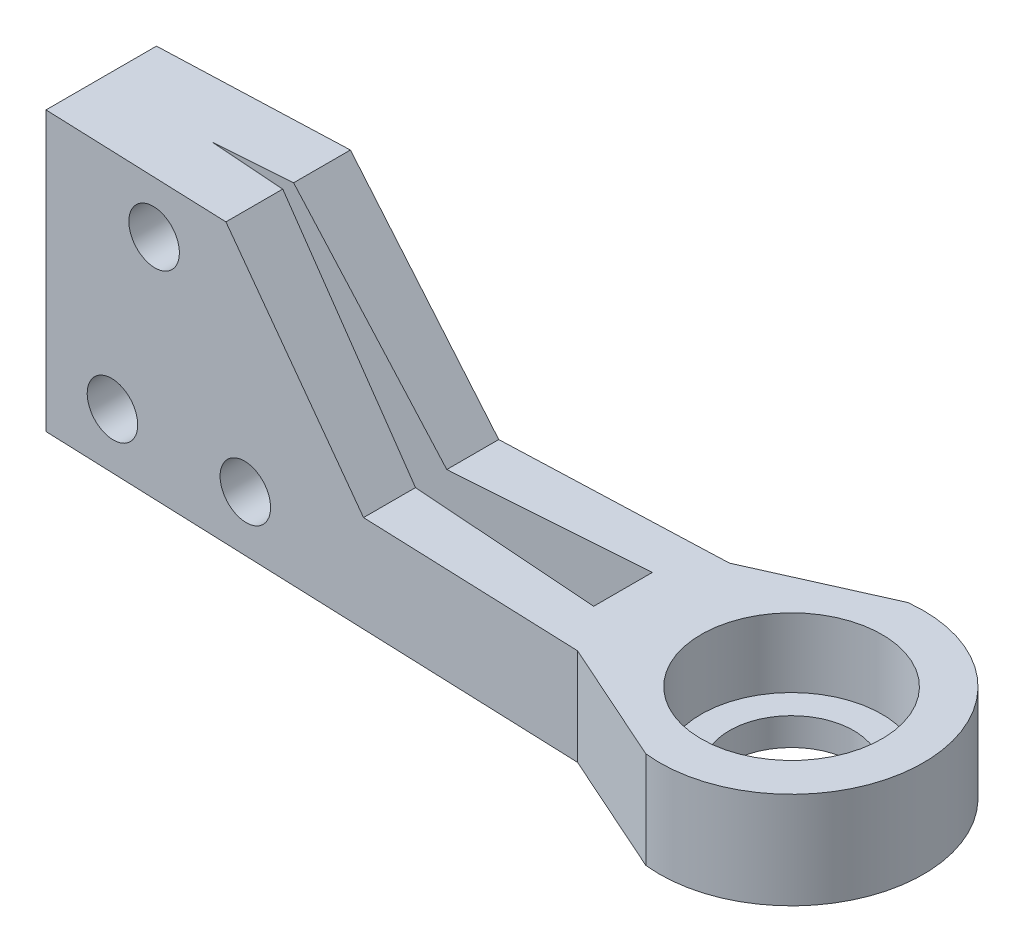
ISO-10303-21;
HEADER;
FILE_DESCRIPTION(('STEP AP214'),'2;1');
FILE_NAME('part.step','',(''),(''),'','','');
FILE_SCHEMA(('AUTOMOTIVE_DESIGN { 1 0 10303 214 1 1 1 1 }'));
ENDSEC;
DATA;
#1=APPLICATION_CONTEXT('core data for automotive mechanical design processes');
#2=APPLICATION_PROTOCOL_DEFINITION('international standard','automotive_design',2000,#1);
#3=PRODUCT_CONTEXT('',#1,'mechanical');
#4=PRODUCT('Part','Part','',(#3));
#5=PRODUCT_RELATED_PRODUCT_CATEGORY('part','',(#4));
#6=PRODUCT_DEFINITION_FORMATION('','',#4);
#7=PRODUCT_DEFINITION_CONTEXT('part definition',#1,'design');
#8=PRODUCT_DEFINITION('design','',#6,#7);
#9=PRODUCT_DEFINITION_SHAPE('','',#8);
#10=(LENGTH_UNIT() NAMED_UNIT(*) SI_UNIT(.MILLI.,.METRE.));
#11=(NAMED_UNIT(*) PLANE_ANGLE_UNIT() SI_UNIT($,.RADIAN.));
#12=(NAMED_UNIT(*) SI_UNIT($,.STERADIAN.) SOLID_ANGLE_UNIT());
#13=UNCERTAINTY_MEASURE_WITH_UNIT(LENGTH_MEASURE(1.E-05),#10,'distance_accuracy_value','');
#14=(GEOMETRIC_REPRESENTATION_CONTEXT(3) GLOBAL_UNCERTAINTY_ASSIGNED_CONTEXT((#13)) GLOBAL_UNIT_ASSIGNED_CONTEXT((#10,
#11,#12)) REPRESENTATION_CONTEXT('',''));
#15=CARTESIAN_POINT('',(0.,0.,0.));
#16=DIRECTION('',(0.,0.,1.));
#17=DIRECTION('',(1.,0.,0.));
#18=AXIS2_PLACEMENT_3D('',#15,#16,#17);
#19=CARTESIAN_POINT('',(0.,7.,0.));
#20=DIRECTION('',(0.,1.,0.));
#21=DIRECTION('',(0.,0.,1.));
#22=AXIS2_PLACEMENT_3D('',#19,#20,#21);
#23=PLANE('',#22);
#24=CARTESIAN_POINT('',(50.,7.,0.));
#25=DIRECTION('',(0.,1.,0.));
#26=DIRECTION('',(0.,0.,1.));
#27=AXIS2_PLACEMENT_3D('',#24,#25,#26);
#28=CIRCLE('',#27,6.55);
#29=CARTESIAN_POINT('',(50.,7.,6.55));
#30=VERTEX_POINT('',#29);
#31=EDGE_CURVE('E218',#30,#30,#28,.T.);
#32=ORIENTED_EDGE('',*,*,#31,.F.);
#33=EDGE_LOOP('',(#32));
#34=FACE_BOUND('',#33,.T.);
#35=DIRECTION('',(0.,0.,-1.));
#36=VECTOR('',#35,1.);
#37=CARTESIAN_POINT('',(23.8949359429024,7.,31.7454653822312));
#38=LINE('',#37,#36);
#39=CARTESIAN_POINT('',(23.8949359429024,7.,-1.13401235386877));
#40=VERTEX_POINT('',#39);
#41=CARTESIAN_POINT('',(23.8949359429024,7.,-4.89606009785884));
#42=VERTEX_POINT('',#41);
#43=EDGE_CURVE('E195',#40,#42,#38,.T.);
#44=ORIENTED_EDGE('',*,*,#43,.F.);
#45=DIRECTION('',(0.997458699830735,0.,-0.0712470499879073));
#46=VECTOR('',#45,1.);
#47=CARTESIAN_POINT('',(0.040704380653495,7.,0.56986132914895));
#48=LINE('',#47,#46);
#49=CARTESIAN_POINT('',(37.7929497533245,7.,-2.12672762604175));
#50=VERTEX_POINT('',#49);
#51=EDGE_CURVE('E175',#40,#50,#48,.T.);
#52=ORIENTED_EDGE('',*,*,#51,.T.);
#53=DIRECTION('',(0.,0.,1.));
#54=VECTOR('',#53,1.);
#55=CARTESIAN_POINT('',(37.7929497533245,7.,0.));
#56=LINE('',#55,#54);
#57=CARTESIAN_POINT('',(37.7929497533245,7.,2.12672762604175));
#58=VERTEX_POINT('',#57);
#59=EDGE_CURVE('E139',#50,#58,#56,.T.);
#60=ORIENTED_EDGE('',*,*,#59,.T.);
#61=DIRECTION('',(-0.997458699830735,0.,-0.0712470499879073));
#62=VECTOR('',#61,1.);
#63=CARTESIAN_POINT('',(0.040704380653495,7.,-0.569861329148949));
#64=LINE('',#63,#62);
#65=CARTESIAN_POINT('',(23.8949359429024,7.,1.13401235386878));
#66=VERTEX_POINT('',#65);
#67=EDGE_CURVE('E167',#58,#66,#64,.T.);
#68=ORIENTED_EDGE('',*,*,#67,.T.);
#69=CARTESIAN_POINT('',(23.8949359429024,7.,4.89606009785884));
#70=VERTEX_POINT('',#69);
#71=EDGE_CURVE('E191',#70,#66,#38,.T.);
#72=ORIENTED_EDGE('',*,*,#71,.F.);
#73=DIRECTION('',(0.999297615709181,0.,0.0374736605890943));
#74=VECTOR('',#73,1.);
#75=CARTESIAN_POINT('',(-0.149789358714308,7.,3.99438289904821));
#76=LINE('',#75,#74);
#77=CARTESIAN_POINT('',(40.,7.,5.5));
#78=VERTEX_POINT('',#77);
#79=EDGE_CURVE('E236',#70,#78,#76,.T.);
#80=ORIENTED_EDGE('',*,*,#79,.T.);
#81=DIRECTION('',(0.913079703293892,0.,0.407781136680865));
#82=VECTOR('',#81,1.);
#83=CARTESIAN_POINT('',(4.60356648121777,7.,-10.3080371764565));
#84=LINE('',#83,#82);
#85=CARTESIAN_POINT('',(48.9351861273453,7.,9.49045159181595));
#86=VERTEX_POINT('',#85);
#87=EDGE_CURVE('E225',#78,#86,#84,.T.);
#88=ORIENTED_EDGE('',*,*,#87,.T.);
#89=CARTESIAN_POINT('',(50.,7.,0.));
#90=DIRECTION('',(0.,1.,0.));
#91=DIRECTION('',(0.,0.,1.));
#92=AXIS2_PLACEMENT_3D('',#89,#90,#91);
#93=CIRCLE('',#92,9.55);
#94=CARTESIAN_POINT('',(48.9351861273453,7.,-9.49045159181595));
#95=VERTEX_POINT('',#94);
#96=EDGE_CURVE('E228',#86,#95,#93,.T.);
#97=ORIENTED_EDGE('',*,*,#96,.T.);
#98=DIRECTION('',(0.913079703293892,0.,-0.407781136680865));
#99=VECTOR('',#98,1.);
#100=CARTESIAN_POINT('',(4.60356648121777,7.,10.3080371764565));
#101=LINE('',#100,#99);
#102=CARTESIAN_POINT('',(40.,7.,-5.5));
#103=VERTEX_POINT('',#102);
#104=EDGE_CURVE('E231',#103,#95,#101,.T.);
#105=ORIENTED_EDGE('',*,*,#104,.F.);
#106=DIRECTION('',(0.999297615709181,0.,-0.0374736605890943));
#107=VECTOR('',#106,1.);
#108=CARTESIAN_POINT('',(-0.149789358714308,7.,-3.99438289904821));
#109=LINE('',#108,#107);
#110=EDGE_CURVE('E234',#42,#103,#109,.T.);
#111=ORIENTED_EDGE('',*,*,#110,.F.);
#112=EDGE_LOOP('',(#44,#52,#60,#68,#72,#80,#88,#97,#105,#111));
#113=FACE_BOUND('',#112,.T.);
#114=ADVANCED_FACE('F35',(#34,#113),#23,.T.);
#115=CARTESIAN_POINT('',(0.,0.,0.));
#116=DIRECTION('',(0.,1.,0.));
#117=DIRECTION('',(0.,0.,1.));
#118=AXIS2_PLACEMENT_3D('',#115,#116,#117);
#119=PLANE('',#118);
#120=DIRECTION('',(0.913079703293892,0.,0.407781136680865));
#121=VECTOR('',#120,1.);
#122=CARTESIAN_POINT('',(4.60356648121777,0.,-10.3080371764565));
#123=LINE('',#122,#121);
#124=CARTESIAN_POINT('',(40.,0.,5.5));
#125=VERTEX_POINT('',#124);
#126=CARTESIAN_POINT('',(48.9351861273453,0.,9.49045159181595));
#127=VERTEX_POINT('',#126);
#128=EDGE_CURVE('E242',#125,#127,#123,.T.);
#129=ORIENTED_EDGE('',*,*,#128,.F.);
#130=DIRECTION('',(0.999297615709181,0.,0.0374736605890943));
#131=VECTOR('',#130,1.);
#132=CARTESIAN_POINT('',(-0.149789358714308,0.,3.99438289904821));
#133=LINE('',#132,#131);
#134=CARTESIAN_POINT('',(0.,0.,4.));
#135=VERTEX_POINT('',#134);
#136=EDGE_CURVE('E229',#135,#125,#133,.T.);
#137=ORIENTED_EDGE('',*,*,#136,.F.);
#138=DIRECTION('',(0.,0.,-1.));
#139=VECTOR('',#138,1.);
#140=CARTESIAN_POINT('',(0.,0.,0.));
#141=LINE('',#140,#139);
#142=CARTESIAN_POINT('',(0.,0.,-4.));
#143=VERTEX_POINT('',#142);
#144=EDGE_CURVE('E254',#135,#143,#141,.T.);
#145=ORIENTED_EDGE('',*,*,#144,.T.);
#146=DIRECTION('',(0.999297615709181,0.,-0.0374736605890943));
#147=VECTOR('',#146,1.);
#148=CARTESIAN_POINT('',(-0.149789358714308,0.,-3.99438289904821));
#149=LINE('',#148,#147);
#150=CARTESIAN_POINT('',(40.,0.,-5.5));
#151=VERTEX_POINT('',#150);
#152=EDGE_CURVE('E251',#143,#151,#149,.T.);
#153=ORIENTED_EDGE('',*,*,#152,.T.);
#154=DIRECTION('',(0.913079703293892,0.,-0.407781136680865));
#155=VECTOR('',#154,1.);
#156=CARTESIAN_POINT('',(4.60356648121777,0.,10.3080371764565));
#157=LINE('',#156,#155);
#158=CARTESIAN_POINT('',(48.9351861273453,0.,-9.49045159181595));
#159=VERTEX_POINT('',#158);
#160=EDGE_CURVE('E248',#151,#159,#157,.T.);
#161=ORIENTED_EDGE('',*,*,#160,.T.);
#162=CARTESIAN_POINT('',(50.,0.,0.));
#163=DIRECTION('',(0.,1.,0.));
#164=DIRECTION('',(0.,0.,1.));
#165=AXIS2_PLACEMENT_3D('',#162,#163,#164);
#166=CIRCLE('',#165,9.55);
#167=EDGE_CURVE('E245',#127,#159,#166,.T.);
#168=ORIENTED_EDGE('',*,*,#167,.F.);
#169=EDGE_LOOP('',(#129,#137,#145,#153,#161,#168));
#170=FACE_BOUND('',#169,.T.);
#171=CARTESIAN_POINT('',(50.,0.,0.));
#172=DIRECTION('',(0.,1.,0.));
#173=DIRECTION('',(0.,0.,1.));
#174=AXIS2_PLACEMENT_3D('',#171,#172,#173);
#175=CIRCLE('',#174,4.5);
#176=CARTESIAN_POINT('',(50.,0.,4.5));
#177=VERTEX_POINT('',#176);
#178=EDGE_CURVE('E239',#177,#177,#175,.T.);
#179=ORIENTED_EDGE('',*,*,#178,.T.);
#180=EDGE_LOOP('',(#179));
#181=FACE_BOUND('',#180,.T.);
#182=DIRECTION('',(-0.997458699830735,0.,0.0712470499879073));
#183=VECTOR('',#182,1.);
#184=CARTESIAN_POINT('',(8.01876298873905,0.,0.));
#185=LINE('',#184,#183);
#186=CARTESIAN_POINT('',(37.7929497533245,0.,-2.12672762604175));
#187=VERTEX_POINT('',#186);
#188=CARTESIAN_POINT('',(8.01876298873905,0.,0.));
#189=VERTEX_POINT('',#188);
#190=EDGE_CURVE('E145',#187,#189,#185,.T.);
#191=ORIENTED_EDGE('',*,*,#190,.T.);
#192=DIRECTION('',(0.997458699830735,0.,0.0712470499879073));
#193=VECTOR('',#192,1.);
#194=CARTESIAN_POINT('',(37.7929497533245,0.,2.12672762604175));
#195=LINE('',#194,#193);
#196=CARTESIAN_POINT('',(37.7929497533246,0.,2.12672762604175));
#197=VERTEX_POINT('',#196);
#198=EDGE_CURVE('E154',#189,#197,#195,.T.);
#199=ORIENTED_EDGE('',*,*,#198,.T.);
#200=DIRECTION('',(0.,0.,-1.));
#201=VECTOR('',#200,1.);
#202=CARTESIAN_POINT('',(37.7929497533245,0.,-2.12672762604175));
#203=LINE('',#202,#201);
#204=EDGE_CURVE('E50',#197,#187,#203,.T.);
#205=ORIENTED_EDGE('',*,*,#204,.T.);
#206=EDGE_LOOP('',(#191,#199,#205));
#207=FACE_BOUND('',#206,.T.);
#208=ADVANCED_FACE('F153',(#170,#181,#207),#119,.F.);
#209=CARTESIAN_POINT('',(15.,4.,10.));
#210=DIRECTION('',(0.,0.,-1.));
#211=DIRECTION('',(-1.,0.,0.));
#212=AXIS2_PLACEMENT_3D('',#209,#210,#211);
#213=CYLINDRICAL_SURFACE('',#212,1.9);
#214=CARTESIAN_POINT('',(15.,4.,-4.5625));
#215=DIRECTION('',(-0.0374736605890943,0.,-0.999297615709181));
#216=DIRECTION('',(0.999297615709181,0.,-0.0374736605890943));
#217=AXIS2_PLACEMENT_3D('',#214,#215,#216);
#218=ELLIPSE('',#217,1.90133546816441,1.9);
#219=CARTESIAN_POINT('',(16.9,4.,-4.63375));
#220=VERTEX_POINT('',#219);
#221=EDGE_CURVE('E211',#220,#220,#218,.F.);
#222=ORIENTED_EDGE('',*,*,#221,.F.);
#223=EDGE_LOOP('',(#222));
#224=FACE_BOUND('',#223,.T.);
#225=CARTESIAN_POINT('',(15.,4.,-0.498659786518623));
#226=DIRECTION('',(0.0712470499879073,0.,0.997458699830735));
#227=DIRECTION('',(0.997458699830735,0.,-0.0712470499879073));
#228=AXIS2_PLACEMENT_3D('',#225,#226,#227);
#229=ELLIPSE('',#228,1.90484077217675,1.9);
#230=CARTESIAN_POINT('',(16.9,4.,-0.634374072232904));
#231=VERTEX_POINT('',#230);
#232=EDGE_CURVE('E177',#231,#231,#229,.T.);
#233=ORIENTED_EDGE('',*,*,#232,.T.);
#234=EDGE_LOOP('',(#233));
#235=FACE_BOUND('',#234,.T.);
#236=ADVANCED_FACE('F327',(#224,#235),#213,.F.);
#237=CARTESIAN_POINT('',(15.,4.,4.5625));
#238=DIRECTION('',(0.0374736605890943,0.,-0.999297615709181));
#239=DIRECTION('',(-0.999297615709181,0.,-0.0374736605890943));
#240=AXIS2_PLACEMENT_3D('',#237,#238,#239);
#241=ELLIPSE('',#240,1.90133546816441,1.9);
#242=CARTESIAN_POINT('',(13.1,4.,4.49125));
#243=VERTEX_POINT('',#242);
#244=EDGE_CURVE('E210',#243,#243,#241,.F.);
#245=ORIENTED_EDGE('',*,*,#244,.T.);
#246=EDGE_LOOP('',(#245));
#247=FACE_BOUND('',#246,.T.);
#248=CARTESIAN_POINT('',(15.,4.,0.498659786518621));
#249=DIRECTION('',(0.0712470499879073,0.,-0.997458699830735));
#250=DIRECTION('',(-0.997458699830735,0.,-0.0712470499879073));
#251=AXIS2_PLACEMENT_3D('',#248,#249,#250);
#252=ELLIPSE('',#251,1.90484077217675,1.9);
#253=CARTESIAN_POINT('',(13.1,4.,0.36294550080434));
#254=VERTEX_POINT('',#253);
#255=EDGE_CURVE('E170',#254,#254,#252,.T.);
#256=ORIENTED_EDGE('',*,*,#255,.T.);
#257=EDGE_LOOP('',(#256));
#258=FACE_BOUND('',#257,.T.);
#259=ADVANCED_FACE('F449',(#247,#258),#213,.F.);
#260=CARTESIAN_POINT('',(23.8949359429024,7.,31.7454653822312));
#261=DIRECTION('',(-0.786306524511475,-0.617836588031727,0.));
#262=DIRECTION('',(0.617836588031727,-0.786306524511475,0.));
#263=AXIS2_PLACEMENT_3D('',#260,#261,#262);
#264=PLANE('',#263);
#265=DIRECTION('',(-0.617235828033225,0.785541950972714,0.0440882734309432));
#266=VECTOR('',#265,1.);
#267=CARTESIAN_POINT('',(23.0001912540286,8.13872114449361,-1.07010201894921));
#268=LINE('',#267,#266);
#269=CARTESIAN_POINT('',(13.540419668512,20.1779565380731,-0.394404048555197));
#270=VERTEX_POINT('',#269);
#271=EDGE_CURVE('E173',#40,#270,#268,.T.);
#272=ORIENTED_EDGE('',*,*,#271,.F.);
#273=ORIENTED_EDGE('',*,*,#43,.T.);
#274=DIRECTION('',(-0.617670828463296,0.786095566091916,0.0231626560673736));
#275=VECTOR('',#274,1.);
#276=CARTESIAN_POINT('',(24.2790676178116,6.51112438449978,-4.91046503566793));
#277=LINE('',#276,#275);
#278=CARTESIAN_POINT('',(13.540419668512,20.1779565380731,-4.50776573756919));
#279=VERTEX_POINT('',#278);
#280=EDGE_CURVE('E186',#42,#279,#277,.T.);
#281=ORIENTED_EDGE('',*,*,#280,.T.);
#282=DIRECTION('',(0.,0.,-1.));
#283=VECTOR('',#282,1.);
#284=CARTESIAN_POINT('',(13.540419668512,20.1779565380731,31.7454653822312));
#285=LINE('',#284,#283);
#286=EDGE_CURVE('E200',#270,#279,#285,.T.);
#287=ORIENTED_EDGE('',*,*,#286,.F.);
#288=EDGE_LOOP('',(#272,#273,#281,#287));
#289=FACE_BOUND('',#288,.T.);
#290=ADVANCED_FACE('F319',(#289),#264,.F.);
#291=DIRECTION('',(0.617235828033225,-0.785541950972714,0.0440882734309432));
#292=VECTOR('',#291,1.);
#293=CARTESIAN_POINT('',(24.727961188488,5.9398277823374,1.19351415712489));
#294=LINE('',#293,#292);
#295=CARTESIAN_POINT('',(13.540419668512,20.1779565380731,0.394404048555197));
#296=VERTEX_POINT('',#295);
#297=EDGE_CURVE('E165',#296,#66,#294,.T.);
#298=ORIENTED_EDGE('',*,*,#297,.F.);
#299=CARTESIAN_POINT('',(13.540419668512,20.1779565380731,4.5077657375692));
#300=VERTEX_POINT('',#299);
#301=EDGE_CURVE('E196',#300,#296,#285,.T.);
#302=ORIENTED_EDGE('',*,*,#301,.F.);
#303=DIRECTION('',(0.617670828463296,-0.786095566091916,0.0231626560673736));
#304=VECTOR('',#303,1.);
#305=CARTESIAN_POINT('',(24.2790676178116,6.51112438449978,4.91046503566793));
#306=LINE('',#305,#304);
#307=EDGE_CURVE('E185',#300,#70,#306,.T.);
#308=ORIENTED_EDGE('',*,*,#307,.T.);
#309=ORIENTED_EDGE('',*,*,#71,.T.);
#310=EDGE_LOOP('',(#298,#302,#308,#309));
#311=FACE_BOUND('',#310,.T.);
#312=ADVANCED_FACE('F288',(#311),#264,.F.);
#313=CARTESIAN_POINT('',(13.540419668512,20.1779565380731,31.7454653822312));
#314=DIRECTION('',(0.,-1.,0.));
#315=DIRECTION('',(0.,0.,-1.));
#316=AXIS2_PLACEMENT_3D('',#313,#314,#315);
#317=PLANE('',#316);
#318=DIRECTION('',(0.997458699830735,0.,-0.0712470499879073));
#319=VECTOR('',#318,1.);
#320=CARTESIAN_POINT('',(8.01876298873905,20.1779565380731,0.));
#321=LINE('',#320,#319);
#322=CARTESIAN_POINT('',(8.01876298873905,20.1779565380731,0.));
#323=VERTEX_POINT('',#322);
#324=EDGE_CURVE('E161',#323,#270,#321,.T.);
#325=ORIENTED_EDGE('',*,*,#324,.T.);
#326=ORIENTED_EDGE('',*,*,#286,.T.);
#327=DIRECTION('',(-0.999297615709181,0.,0.0374736605890943));
#328=VECTOR('',#327,1.);
#329=CARTESIAN_POINT('',(14.5603990591687,20.1779565380731,-4.54601496471883));
#330=LINE('',#329,#328);
#331=CARTESIAN_POINT('',(0.,20.1779565380731,-4.));
#332=VERTEX_POINT('',#331);
#333=EDGE_CURVE('E181',#279,#332,#330,.T.);
#334=ORIENTED_EDGE('',*,*,#333,.T.);
#335=DIRECTION('',(0.,0.,-1.));
#336=VECTOR('',#335,1.);
#337=CARTESIAN_POINT('',(0.,20.1779565380731,31.7454653822312));
#338=LINE('',#337,#336);
#339=CARTESIAN_POINT('',(0.,20.1779565380731,4.));
#340=VERTEX_POINT('',#339);
#341=EDGE_CURVE('E199',#340,#332,#338,.T.);
#342=ORIENTED_EDGE('',*,*,#341,.F.);
#343=DIRECTION('',(0.999297615709181,0.,0.0374736605890943));
#344=VECTOR('',#343,1.);
#345=CARTESIAN_POINT('',(14.5603990591687,20.1779565380731,4.54601496471883));
#346=LINE('',#345,#344);
#347=EDGE_CURVE('E194',#340,#300,#346,.T.);
#348=ORIENTED_EDGE('',*,*,#347,.T.);
#349=ORIENTED_EDGE('',*,*,#301,.T.);
#350=DIRECTION('',(-0.997458699830735,0.,-0.0712470499879073));
#351=VECTOR('',#350,1.);
#352=CARTESIAN_POINT('',(37.7929497533245,20.1779565380731,2.12672762604175));
#353=LINE('',#352,#351);
#354=EDGE_CURVE('E164',#296,#323,#353,.T.);
#355=ORIENTED_EDGE('',*,*,#354,.T.);
#356=EDGE_LOOP('',(#325,#326,#334,#342,#348,#349,#355));
#357=FACE_BOUND('',#356,.T.);
#358=ADVANCED_FACE('F284',(#357),#317,.F.);
#359=CARTESIAN_POINT('',(8.13636436420664,16.4184855912116,31.7454653822312));
#360=DIRECTION('',(0.,0.,-1.));
#361=DIRECTION('',(-1.,0.,0.));
#362=AXIS2_PLACEMENT_3D('',#359,#360,#361);
#363=CYLINDRICAL_SURFACE('',#362,1.89999999999999);
#364=CARTESIAN_POINT('',(8.13636436420664,16.4184855912116,4.30511366365775));
#365=DIRECTION('',(0.0374736605890943,0.,-0.999297615709181));
#366=DIRECTION('',(-0.999297615709181,0.,-0.0374736605890943));
#367=AXIS2_PLACEMENT_3D('',#364,#365,#366);
#368=ELLIPSE('',#367,1.90133546816441,1.89999999999999);
#369=CARTESIAN_POINT('',(6.23636436420665,16.4184855912116,4.23386366365775));
#370=VERTEX_POINT('',#369);
#371=EDGE_CURVE('E203',#370,#370,#368,.T.);
#372=ORIENTED_EDGE('',*,*,#371,.F.);
#373=EDGE_LOOP('',(#372));
#374=FACE_BOUND('',#373,.T.);
#375=CARTESIAN_POINT('',(8.13636436420664,16.4184855912116,-4.30511366365775));
#376=DIRECTION('',(-0.0374736605890943,0.,-0.999297615709181));
#377=DIRECTION('',(-0.999297615709181,0.,0.0374736605890943));
#378=AXIS2_PLACEMENT_3D('',#375,#376,#377);
#379=ELLIPSE('',#378,1.90133546816441,1.89999999999999);
#380=CARTESIAN_POINT('',(6.23636436420665,16.4184855912116,-4.23386366365775));
#381=VERTEX_POINT('',#380);
#382=EDGE_CURVE('E182',#381,#381,#379,.F.);
#383=ORIENTED_EDGE('',*,*,#382,.F.);
#384=EDGE_LOOP('',(#383));
#385=FACE_BOUND('',#384,.T.);
#386=CARTESIAN_POINT('',(8.13636436420664,16.4184855912116,0.00840009824769339));
#387=DIRECTION('',(0.0712470499879073,0.,-0.997458699830735));
#388=DIRECTION('',(-0.997458699830735,0.,-0.0712470499879073));
#389=AXIS2_PLACEMENT_3D('',#386,#387,#388);
#390=ELLIPSE('',#389,1.90484077217675,1.89999999999999);
#391=CARTESIAN_POINT('',(8.01876298873905,18.3148426030868,0.));
#392=VERTEX_POINT('',#391);
#393=CARTESIAN_POINT('',(8.01876298873905,14.5221285793365,0.));
#394=VERTEX_POINT('',#393);
#395=EDGE_CURVE('E43',#392,#394,#390,.T.);
#396=ORIENTED_EDGE('',*,*,#395,.T.);
#397=CARTESIAN_POINT('',(8.13636436420664,16.4184855912116,-0.00840009824768645));
#398=DIRECTION('',(0.0712470499879073,0.,0.997458699830735));
#399=DIRECTION('',(0.997458699830735,0.,-0.0712470499879073));
#400=AXIS2_PLACEMENT_3D('',#397,#398,#399);
#401=ELLIPSE('',#400,1.90484077217675,1.89999999999999);
#402=EDGE_CURVE('E11',#394,#392,#401,.T.);
#403=ORIENTED_EDGE('',*,*,#402,.T.);
#404=EDGE_LOOP('',(#396,#403));
#405=FACE_BOUND('',#404,.T.);
#406=ADVANCED_FACE('F278',(#374,#385,#405),#363,.F.);
#407=CARTESIAN_POINT('',(50.,7.,0.));
#408=DIRECTION('',(0.,-1.,0.));
#409=DIRECTION('',(0.,0.,-1.));
#410=AXIS2_PLACEMENT_3D('',#407,#408,#409);
#411=CYLINDRICAL_SURFACE('',#410,4.5);
#412=ORIENTED_EDGE('',*,*,#178,.F.);
#413=EDGE_LOOP('',(#412));
#414=FACE_BOUND('',#413,.T.);
#415=CARTESIAN_POINT('',(50.,2.,0.));
#416=DIRECTION('',(0.,1.,0.));
#417=DIRECTION('',(0.,0.,1.));
#418=AXIS2_PLACEMENT_3D('',#415,#416,#417);
#419=CIRCLE('',#418,4.5);
#420=CARTESIAN_POINT('',(50.,2.,4.5));
#421=VERTEX_POINT('',#420);
#422=EDGE_CURVE('E222',#421,#421,#419,.T.);
#423=ORIENTED_EDGE('',*,*,#422,.T.);
#424=EDGE_LOOP('',(#423));
#425=FACE_BOUND('',#424,.T.);
#426=ADVANCED_FACE('F37',(#414,#425),#411,.F.);
#427=CARTESIAN_POINT('',(4.60356648121777,7.,-10.3080371764565));
#428=DIRECTION('',(0.407781136680865,0.,-0.913079703293892));
#429=DIRECTION('',(-0.913079703293892,0.,-0.407781136680865));
#430=AXIS2_PLACEMENT_3D('',#427,#428,#429);
#431=PLANE('',#430);
#432=ORIENTED_EDGE('',*,*,#128,.T.);
#433=DIRECTION('',(0.,-1.,0.));
#434=VECTOR('',#433,1.);
#435=CARTESIAN_POINT('',(48.9351861273453,7.,9.49045159181595));
#436=LINE('',#435,#434);
#437=EDGE_CURVE('E268',#86,#127,#436,.T.);
#438=ORIENTED_EDGE('',*,*,#437,.F.);
#439=ORIENTED_EDGE('',*,*,#87,.F.);
#440=DIRECTION('',(0.,-1.,0.));
#441=VECTOR('',#440,1.);
#442=CARTESIAN_POINT('',(40.,7.,5.5));
#443=LINE('',#442,#441);
#444=EDGE_CURVE('E238',#78,#125,#443,.T.);
#445=ORIENTED_EDGE('',*,*,#444,.T.);
#446=EDGE_LOOP('',(#432,#438,#439,#445));
#447=FACE_BOUND('',#446,.T.);
#448=ADVANCED_FACE('F302',(#447),#431,.F.);
#449=CARTESIAN_POINT('',(50.,7.,0.));
#450=DIRECTION('',(0.,-1.,0.));
#451=DIRECTION('',(0.,0.,-1.));
#452=AXIS2_PLACEMENT_3D('',#449,#450,#451);
#453=CYLINDRICAL_SURFACE('',#452,9.55);
#454=ORIENTED_EDGE('',*,*,#167,.T.);
#455=DIRECTION('',(0.,-1.,0.));
#456=VECTOR('',#455,1.);
#457=CARTESIAN_POINT('',(48.9351861273453,7.,-9.49045159181595));
#458=LINE('',#457,#456);
#459=EDGE_CURVE('E266',#95,#159,#458,.T.);
#460=ORIENTED_EDGE('',*,*,#459,.F.);
#461=ORIENTED_EDGE('',*,*,#96,.F.);
#462=ORIENTED_EDGE('',*,*,#437,.T.);
#463=EDGE_LOOP('',(#454,#460,#461,#462));
#464=FACE_BOUND('',#463,.T.);
#465=ADVANCED_FACE('F307',(#464),#453,.T.);
#466=CARTESIAN_POINT('',(4.60356648121777,7.,10.3080371764565));
#467=DIRECTION('',(-0.407781136680865,0.,-0.913079703293892));
#468=DIRECTION('',(-0.913079703293892,0.,0.407781136680865));
#469=AXIS2_PLACEMENT_3D('',#466,#467,#468);
#470=PLANE('',#469);
#471=ORIENTED_EDGE('',*,*,#160,.F.);
#472=DIRECTION('',(0.,-1.,0.));
#473=VECTOR('',#472,1.);
#474=CARTESIAN_POINT('',(40.,7.,-5.5));
#475=LINE('',#474,#473);
#476=EDGE_CURVE('E264',#103,#151,#475,.T.);
#477=ORIENTED_EDGE('',*,*,#476,.F.);
#478=ORIENTED_EDGE('',*,*,#104,.T.);
#479=ORIENTED_EDGE('',*,*,#459,.T.);
#480=EDGE_LOOP('',(#471,#477,#478,#479));
#481=FACE_BOUND('',#480,.T.);
#482=ADVANCED_FACE('F311',(#481),#470,.T.);
#483=CARTESIAN_POINT('',(-0.149789358714308,7.,-3.99438289904821));
#484=DIRECTION('',(-0.0374736605890943,0.,-0.999297615709181));
#485=DIRECTION('',(-0.999297615709181,0.,0.0374736605890943));
#486=AXIS2_PLACEMENT_3D('',#483,#484,#485);
#487=PLANE('',#486);
#488=CARTESIAN_POINT('',(5.,4.,-4.1875));
#489=DIRECTION('',(-0.0374736605890943,0.,-0.999297615709181));
#490=DIRECTION('',(0.999297615709181,0.,-0.0374736605890943));
#491=AXIS2_PLACEMENT_3D('',#488,#489,#490);
#492=ELLIPSE('',#491,1.90133546816442,1.9);
#493=CARTESIAN_POINT('',(6.9,4.,-4.25875));
#494=VERTEX_POINT('',#493);
#495=EDGE_CURVE('E215',#494,#494,#492,.F.);
#496=ORIENTED_EDGE('',*,*,#495,.T.);
#497=EDGE_LOOP('',(#496));
#498=FACE_BOUND('',#497,.T.);
#499=ORIENTED_EDGE('',*,*,#221,.T.);
#500=EDGE_LOOP('',(#499));
#501=FACE_BOUND('',#500,.T.);
#502=ORIENTED_EDGE('',*,*,#152,.F.);
#503=DIRECTION('',(0.,-1.,0.));
#504=VECTOR('',#503,1.);
#505=CARTESIAN_POINT('',(0.,7.,-4.));
#506=LINE('',#505,#504);
#507=EDGE_CURVE('E262',#332,#143,#506,.T.);
#508=ORIENTED_EDGE('',*,*,#507,.F.);
#509=ORIENTED_EDGE('',*,*,#333,.F.);
#510=ORIENTED_EDGE('',*,*,#280,.F.);
#511=ORIENTED_EDGE('',*,*,#110,.T.);
#512=ORIENTED_EDGE('',*,*,#476,.T.);
#513=EDGE_LOOP('',(#502,#508,#509,#510,#511,#512));
#514=FACE_BOUND('',#513,.T.);
#515=ORIENTED_EDGE('',*,*,#382,.T.);
#516=EDGE_LOOP('',(#515));
#517=FACE_BOUND('',#516,.T.);
#518=ADVANCED_FACE('F314',(#498,#501,#514,#517),#487,.T.);
#519=CARTESIAN_POINT('',(0.,7.,0.));
#520=DIRECTION('',(-1.,0.,0.));
#521=DIRECTION('',(0.,0.,1.));
#522=AXIS2_PLACEMENT_3D('',#519,#520,#521);
#523=PLANE('',#522);
#524=ORIENTED_EDGE('',*,*,#144,.F.);
#525=DIRECTION('',(0.,-1.,0.));
#526=VECTOR('',#525,1.);
#527=CARTESIAN_POINT('',(0.,7.,4.));
#528=LINE('',#527,#526);
#529=EDGE_CURVE('E260',#340,#135,#528,.T.);
#530=ORIENTED_EDGE('',*,*,#529,.F.);
#531=ORIENTED_EDGE('',*,*,#341,.T.);
#532=ORIENTED_EDGE('',*,*,#507,.T.);
#533=EDGE_LOOP('',(#524,#530,#531,#532));
#534=FACE_BOUND('',#533,.T.);
#535=ADVANCED_FACE('F323',(#534),#523,.T.);
#536=CARTESIAN_POINT('',(-0.149789358714308,7.,3.99438289904821));
#537=DIRECTION('',(0.0374736605890943,0.,-0.999297615709181));
#538=DIRECTION('',(-0.999297615709181,0.,-0.0374736605890943));
#539=AXIS2_PLACEMENT_3D('',#536,#537,#538);
#540=PLANE('',#539);
#541=CARTESIAN_POINT('',(5.,4.,4.1875));
#542=DIRECTION('',(0.0374736605890943,0.,-0.999297615709181));
#543=DIRECTION('',(-0.999297615709181,0.,-0.0374736605890943));
#544=AXIS2_PLACEMENT_3D('',#541,#542,#543);
#545=ELLIPSE('',#544,1.90133546816442,1.9);
#546=CARTESIAN_POINT('',(3.1,4.,4.11625));
#547=VERTEX_POINT('',#546);
#548=EDGE_CURVE('E214',#547,#547,#545,.F.);
#549=ORIENTED_EDGE('',*,*,#548,.F.);
#550=EDGE_LOOP('',(#549));
#551=FACE_BOUND('',#550,.T.);
#552=ORIENTED_EDGE('',*,*,#244,.F.);
#553=EDGE_LOOP('',(#552));
#554=FACE_BOUND('',#553,.T.);
#555=ORIENTED_EDGE('',*,*,#136,.T.);
#556=ORIENTED_EDGE('',*,*,#444,.F.);
#557=ORIENTED_EDGE('',*,*,#79,.F.);
#558=ORIENTED_EDGE('',*,*,#307,.F.);
#559=ORIENTED_EDGE('',*,*,#347,.F.);
#560=ORIENTED_EDGE('',*,*,#529,.T.);
#561=EDGE_LOOP('',(#555,#556,#557,#558,#559,#560));
#562=FACE_BOUND('',#561,.T.);
#563=ORIENTED_EDGE('',*,*,#371,.T.);
#564=EDGE_LOOP('',(#563));
#565=FACE_BOUND('',#564,.T.);
#566=ADVANCED_FACE('F294',(#551,#554,#562,#565),#540,.F.);
#567=CARTESIAN_POINT('',(50.,2.,0.));
#568=DIRECTION('',(0.,1.,0.));
#569=DIRECTION('',(0.,0.,1.));
#570=AXIS2_PLACEMENT_3D('',#567,#568,#569);
#571=CYLINDRICAL_SURFACE('',#570,6.55);
#572=CARTESIAN_POINT('',(50.,2.,0.));
#573=DIRECTION('',(0.,1.,0.));
#574=DIRECTION('',(0.,0.,1.));
#575=AXIS2_PLACEMENT_3D('',#572,#573,#574);
#576=CIRCLE('',#575,6.55);
#577=CARTESIAN_POINT('',(50.,2.,6.55));
#578=VERTEX_POINT('',#577);
#579=EDGE_CURVE('E219',#578,#578,#576,.T.);
#580=ORIENTED_EDGE('',*,*,#579,.F.);
#581=EDGE_LOOP('',(#580));
#582=FACE_BOUND('',#581,.T.);
#583=ORIENTED_EDGE('',*,*,#31,.T.);
#584=EDGE_LOOP('',(#583));
#585=FACE_BOUND('',#584,.T.);
#586=ADVANCED_FACE('F339',(#582,#585),#571,.F.);
#587=CARTESIAN_POINT('',(50.,2.,0.));
#588=DIRECTION('',(0.,1.,0.));
#589=DIRECTION('',(0.,0.,1.));
#590=AXIS2_PLACEMENT_3D('',#587,#588,#589);
#591=PLANE('',#590);
#592=ORIENTED_EDGE('',*,*,#422,.F.);
#593=EDGE_LOOP('',(#592));
#594=FACE_BOUND('',#593,.T.);
#595=ORIENTED_EDGE('',*,*,#579,.T.);
#596=EDGE_LOOP('',(#595));
#597=FACE_BOUND('',#596,.T.);
#598=ADVANCED_FACE('F335',(#594,#597),#591,.T.);
#599=CARTESIAN_POINT('',(5.,4.,10.));
#600=DIRECTION('',(0.,0.,-1.));
#601=DIRECTION('',(-1.,0.,0.));
#602=AXIS2_PLACEMENT_3D('',#599,#600,#601);
#603=CYLINDRICAL_SURFACE('',#602,1.9);
#604=ORIENTED_EDGE('',*,*,#495,.F.);
#605=EDGE_LOOP('',(#604));
#606=FACE_BOUND('',#605,.T.);
#607=ORIENTED_EDGE('',*,*,#548,.T.);
#608=EDGE_LOOP('',(#607));
#609=FACE_BOUND('',#608,.T.);
#610=ADVANCED_FACE('F338',(#606,#609),#603,.F.);
#611=CARTESIAN_POINT('',(8.01876298873905,50.2544270602919,0.));
#612=DIRECTION('',(0.0712470499879073,0.,0.997458699830735));
#613=DIRECTION('',(0.997458699830735,0.,-0.0712470499879073));
#614=AXIS2_PLACEMENT_3D('',#611,#612,#613);
#615=PLANE('',#614);
#616=ORIENTED_EDGE('',*,*,#232,.F.);
#617=EDGE_LOOP('',(#616));
#618=FACE_BOUND('',#617,.T.);
#619=ORIENTED_EDGE('',*,*,#271,.T.);
#620=ORIENTED_EDGE('',*,*,#324,.F.);
#621=DIRECTION('',(0.,-1.,0.));
#622=VECTOR('',#621,1.);
#623=CARTESIAN_POINT('',(8.01876298873905,50.2544270602919,0.));
#624=LINE('',#623,#622);
#625=EDGE_CURVE('E58',#323,#392,#624,.T.);
#626=ORIENTED_EDGE('',*,*,#625,.T.);
#627=ORIENTED_EDGE('',*,*,#402,.F.);
#628=EDGE_CURVE('E148',#394,#189,#624,.T.);
#629=ORIENTED_EDGE('',*,*,#628,.T.);
#630=ORIENTED_EDGE('',*,*,#190,.F.);
#631=DIRECTION('',(0.,-1.,0.));
#632=VECTOR('',#631,1.);
#633=CARTESIAN_POINT('',(37.7929497533245,50.2544270602919,-2.12672762604175));
#634=LINE('',#633,#632);
#635=EDGE_CURVE('E135',#50,#187,#634,.T.);
#636=ORIENTED_EDGE('',*,*,#635,.F.);
#637=ORIENTED_EDGE('',*,*,#51,.F.);
#638=EDGE_LOOP('',(#619,#620,#626,#627,#629,#630,#636,#637));
#639=FACE_BOUND('',#638,.T.);
#640=ADVANCED_FACE('F146',(#618,#639),#615,.T.);
#641=CARTESIAN_POINT('',(37.7929497533245,50.2544270602919,-2.12672762604175));
#642=DIRECTION('',(-1.,0.,0.));
#643=DIRECTION('',(0.,0.,1.));
#644=AXIS2_PLACEMENT_3D('',#641,#642,#643);
#645=PLANE('',#644);
#646=ORIENTED_EDGE('',*,*,#635,.T.);
#647=ORIENTED_EDGE('',*,*,#204,.F.);
#648=DIRECTION('',(0.,-1.,0.));
#649=VECTOR('',#648,1.);
#650=CARTESIAN_POINT('',(37.7929497533245,50.2544270602919,2.12672762604175));
#651=LINE('',#650,#649);
#652=EDGE_CURVE('E142',#58,#197,#651,.T.);
#653=ORIENTED_EDGE('',*,*,#652,.F.);
#654=ORIENTED_EDGE('',*,*,#59,.F.);
#655=EDGE_LOOP('',(#646,#647,#653,#654));
#656=FACE_BOUND('',#655,.T.);
#657=ADVANCED_FACE('F137',(#656),#645,.T.);
#658=CARTESIAN_POINT('',(37.7929497533245,50.2544270602919,2.12672762604175));
#659=DIRECTION('',(0.0712470499879073,0.,-0.997458699830735));
#660=DIRECTION('',(-0.997458699830735,0.,-0.0712470499879073));
#661=AXIS2_PLACEMENT_3D('',#658,#659,#660);
#662=PLANE('',#661);
#663=ORIENTED_EDGE('',*,*,#255,.F.);
#664=EDGE_LOOP('',(#663));
#665=FACE_BOUND('',#664,.T.);
#666=ORIENTED_EDGE('',*,*,#652,.T.);
#667=ORIENTED_EDGE('',*,*,#198,.F.);
#668=ORIENTED_EDGE('',*,*,#628,.F.);
#669=ORIENTED_EDGE('',*,*,#395,.F.);
#670=ORIENTED_EDGE('',*,*,#625,.F.);
#671=ORIENTED_EDGE('',*,*,#354,.F.);
#672=ORIENTED_EDGE('',*,*,#297,.T.);
#673=ORIENTED_EDGE('',*,*,#67,.F.);
#674=EDGE_LOOP('',(#666,#667,#668,#669,#670,#671,#672,#673));
#675=FACE_BOUND('',#674,.T.);
#676=ADVANCED_FACE('F279',(#665,#675),#662,.T.);
#677=CLOSED_SHELL('',(#114,#208,#236,#259,#290,#312,#358,#406,#426,#448,#465,#482,#518,#535,
#566,#586,#598,#610,#640,#657,#676));
#678=MANIFOLD_SOLID_BREP('B2',#677);
#679=ADVANCED_BREP_SHAPE_REPRESENTATION('',(#18,#678),#14);
#680=SHAPE_DEFINITION_REPRESENTATION(#9,#679);
ENDSEC;
END-ISO-10303-21;
